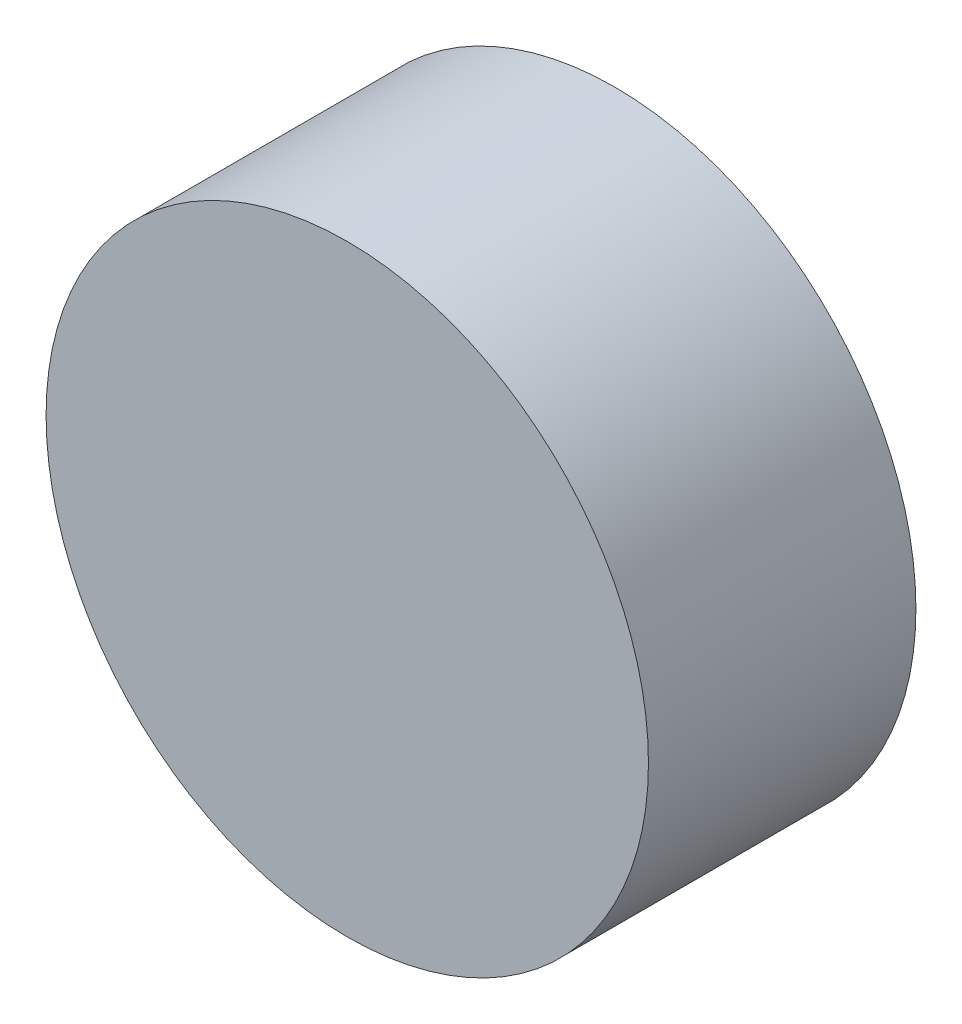
ISO-10303-21;
HEADER;
FILE_DESCRIPTION(('STEP AP214'),'2;1');
FILE_NAME('part.step','',(''),(''),'','','');
FILE_SCHEMA(('AUTOMOTIVE_DESIGN { 1 0 10303 214 1 1 1 1 }'));
ENDSEC;
DATA;
#1=APPLICATION_CONTEXT('core data for automotive mechanical design processes');
#2=APPLICATION_PROTOCOL_DEFINITION('international standard','automotive_design',2000,#1);
#3=PRODUCT_CONTEXT('',#1,'mechanical');
#4=PRODUCT('Part','Part','',(#3));
#5=PRODUCT_RELATED_PRODUCT_CATEGORY('part','',(#4));
#6=PRODUCT_DEFINITION_FORMATION('','',#4);
#7=PRODUCT_DEFINITION_CONTEXT('part definition',#1,'design');
#8=PRODUCT_DEFINITION('design','',#6,#7);
#9=PRODUCT_DEFINITION_SHAPE('','',#8);
#10=(LENGTH_UNIT() NAMED_UNIT(*) SI_UNIT(.MILLI.,.METRE.));
#11=(NAMED_UNIT(*) PLANE_ANGLE_UNIT() SI_UNIT($,.RADIAN.));
#12=(NAMED_UNIT(*) SI_UNIT($,.STERADIAN.) SOLID_ANGLE_UNIT());
#13=UNCERTAINTY_MEASURE_WITH_UNIT(LENGTH_MEASURE(1.E-05),#10,'distance_accuracy_value','');
#14=(GEOMETRIC_REPRESENTATION_CONTEXT(3) GLOBAL_UNCERTAINTY_ASSIGNED_CONTEXT((#13)) GLOBAL_UNIT_ASSIGNED_CONTEXT((#10,
#11,#12)) REPRESENTATION_CONTEXT('',''));
#15=CARTESIAN_POINT('',(0.,0.,0.));
#16=DIRECTION('',(0.,0.,1.));
#17=DIRECTION('',(1.,0.,0.));
#18=AXIS2_PLACEMENT_3D('',#15,#16,#17);
#19=CARTESIAN_POINT('',(0.,0.,1.11));
#20=DIRECTION('',(0.,0.,-1.));
#21=DIRECTION('',(-1.,0.,0.));
#22=AXIS2_PLACEMENT_3D('',#19,#20,#21);
#23=CYLINDRICAL_SURFACE('',#22,1.25);
#24=CARTESIAN_POINT('',(0.,0.,1.11));
#25=DIRECTION('',(0.,0.,1.));
#26=DIRECTION('',(1.,0.,0.));
#27=AXIS2_PLACEMENT_3D('',#24,#25,#26);
#28=CIRCLE('',#27,1.25);
#29=CARTESIAN_POINT('',(1.25,0.,1.11));
#30=VERTEX_POINT('',#29);
#31=EDGE_CURVE('E10',#30,#30,#28,.T.);
#32=ORIENTED_EDGE('',*,*,#31,.F.);
#33=EDGE_LOOP('',(#32));
#34=FACE_BOUND('',#33,.T.);
#35=CARTESIAN_POINT('',(0.,0.,0.));
#36=DIRECTION('',(0.,0.,1.));
#37=DIRECTION('',(1.,0.,0.));
#38=AXIS2_PLACEMENT_3D('',#35,#36,#37);
#39=CIRCLE('',#38,1.25);
#40=CARTESIAN_POINT('',(1.25,0.,0.));
#41=VERTEX_POINT('',#40);
#42=EDGE_CURVE('E34',#41,#41,#39,.T.);
#43=ORIENTED_EDGE('',*,*,#42,.T.);
#44=EDGE_LOOP('',(#43));
#45=FACE_BOUND('',#44,.T.);
#46=ADVANCED_FACE('F31',(#34,#45),#23,.T.);
#47=CARTESIAN_POINT('',(0.,0.,1.11));
#48=DIRECTION('',(0.,0.,1.));
#49=DIRECTION('',(1.,0.,0.));
#50=AXIS2_PLACEMENT_3D('',#47,#48,#49);
#51=PLANE('',#50);
#52=ORIENTED_EDGE('',*,*,#31,.T.);
#53=EDGE_LOOP('',(#52));
#54=FACE_BOUND('',#53,.T.);
#55=ADVANCED_FACE('F46',(#54),#51,.T.);
#56=CARTESIAN_POINT('',(0.,0.,0.));
#57=DIRECTION('',(0.,0.,1.));
#58=DIRECTION('',(1.,0.,0.));
#59=AXIS2_PLACEMENT_3D('',#56,#57,#58);
#60=PLANE('',#59);
#61=ORIENTED_EDGE('',*,*,#42,.F.);
#62=EDGE_LOOP('',(#61));
#63=FACE_BOUND('',#62,.T.);
#64=ADVANCED_FACE('F44',(#63),#60,.F.);
#65=CLOSED_SHELL('',(#46,#55,#64));
#66=MANIFOLD_SOLID_BREP('B2',#65);
#67=ADVANCED_BREP_SHAPE_REPRESENTATION('',(#18,#66),#14);
#68=SHAPE_DEFINITION_REPRESENTATION(#9,#67);
ENDSEC;
END-ISO-10303-21;
